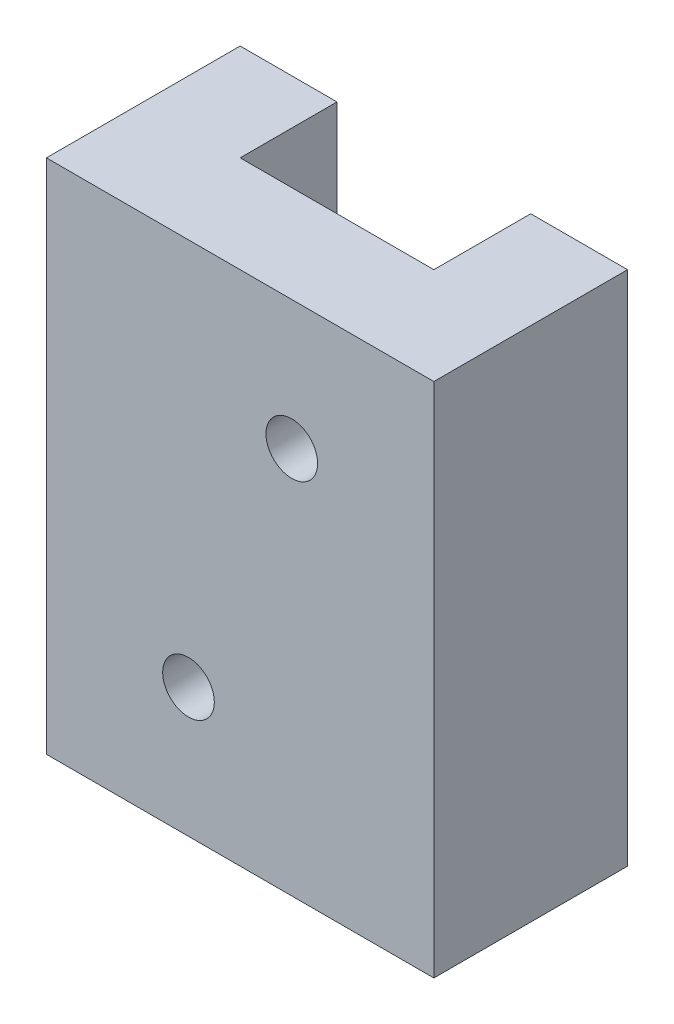
ISO-10303-21;
HEADER;
FILE_DESCRIPTION(('STEP AP214'),'2;1');
FILE_NAME('part.step','',(''),(''),'','','');
FILE_SCHEMA(('AUTOMOTIVE_DESIGN { 1 0 10303 214 1 1 1 1 }'));
ENDSEC;
DATA;
#1=APPLICATION_CONTEXT('core data for automotive mechanical design processes');
#2=APPLICATION_PROTOCOL_DEFINITION('international standard','automotive_design',2000,#1);
#3=PRODUCT_CONTEXT('',#1,'mechanical');
#4=PRODUCT('Part','Part','',(#3));
#5=PRODUCT_RELATED_PRODUCT_CATEGORY('part','',(#4));
#6=PRODUCT_DEFINITION_FORMATION('','',#4);
#7=PRODUCT_DEFINITION_CONTEXT('part definition',#1,'design');
#8=PRODUCT_DEFINITION('design','',#6,#7);
#9=PRODUCT_DEFINITION_SHAPE('','',#8);
#10=(LENGTH_UNIT() NAMED_UNIT(*) SI_UNIT(.MILLI.,.METRE.));
#11=(NAMED_UNIT(*) PLANE_ANGLE_UNIT() SI_UNIT($,.RADIAN.));
#12=(NAMED_UNIT(*) SI_UNIT($,.STERADIAN.) SOLID_ANGLE_UNIT());
#13=UNCERTAINTY_MEASURE_WITH_UNIT(LENGTH_MEASURE(1.E-05),#10,'distance_accuracy_value','');
#14=(GEOMETRIC_REPRESENTATION_CONTEXT(3) GLOBAL_UNCERTAINTY_ASSIGNED_CONTEXT((#13)) GLOBAL_UNIT_ASSIGNED_CONTEXT((#10,
#11,#12)) REPRESENTATION_CONTEXT('',''));
#15=CARTESIAN_POINT('',(0.,0.,0.));
#16=DIRECTION('',(0.,0.,1.));
#17=DIRECTION('',(1.,0.,0.));
#18=AXIS2_PLACEMENT_3D('',#15,#16,#17);
#19=CARTESIAN_POINT('',(-3.75,20.,3.75));
#20=DIRECTION('',(-1.,0.,0.));
#21=DIRECTION('',(0.,0.,1.));
#22=AXIS2_PLACEMENT_3D('',#19,#20,#21);
#23=PLANE('',#22);
#24=DIRECTION('',(0.,0.,-1.));
#25=VECTOR('',#24,1.);
#26=CARTESIAN_POINT('',(-3.75,0.,3.75));
#27=LINE('',#26,#25);
#28=CARTESIAN_POINT('',(-3.75,0.,3.75));
#29=VERTEX_POINT('',#28);
#30=CARTESIAN_POINT('',(-3.75,0.,0.));
#31=VERTEX_POINT('',#30);
#32=EDGE_CURVE('E138',#29,#31,#27,.T.);
#33=ORIENTED_EDGE('',*,*,#32,.T.);
#34=DIRECTION('',(0.,-1.,0.));
#35=VECTOR('',#34,1.);
#36=CARTESIAN_POINT('',(-3.75,20.,0.));
#37=LINE('',#36,#35);
#38=CARTESIAN_POINT('',(-3.75,20.,0.));
#39=VERTEX_POINT('',#38);
#40=EDGE_CURVE('E11',#39,#31,#37,.T.);
#41=ORIENTED_EDGE('',*,*,#40,.F.);
#42=DIRECTION('',(0.,0.,-1.));
#43=VECTOR('',#42,1.);
#44=CARTESIAN_POINT('',(-3.75,20.,3.75));
#45=LINE('',#44,#43);
#46=CARTESIAN_POINT('',(-3.75,20.,3.75));
#47=VERTEX_POINT('',#46);
#48=EDGE_CURVE('E153',#47,#39,#45,.T.);
#49=ORIENTED_EDGE('',*,*,#48,.F.);
#50=DIRECTION('',(0.,-1.,0.));
#51=VECTOR('',#50,1.);
#52=CARTESIAN_POINT('',(-3.75,20.,3.75));
#53=LINE('',#52,#51);
#54=EDGE_CURVE('E134',#47,#29,#53,.T.);
#55=ORIENTED_EDGE('',*,*,#54,.T.);
#56=EDGE_LOOP('',(#33,#41,#49,#55));
#57=FACE_BOUND('',#56,.T.);
#58=ADVANCED_FACE('F42',(#57),#23,.F.);
#59=CARTESIAN_POINT('',(-3.75,20.,0.));
#60=DIRECTION('',(0.,0.,1.));
#61=DIRECTION('',(1.,0.,0.));
#62=AXIS2_PLACEMENT_3D('',#59,#60,#61);
#63=PLANE('',#62);
#64=DIRECTION('',(-1.,0.,0.));
#65=VECTOR('',#64,1.);
#66=CARTESIAN_POINT('',(-3.75,0.,0.));
#67=LINE('',#66,#65);
#68=CARTESIAN_POINT('',(-7.5,0.,0.));
#69=VERTEX_POINT('',#68);
#70=EDGE_CURVE('E141',#31,#69,#67,.T.);
#71=ORIENTED_EDGE('',*,*,#70,.T.);
#72=DIRECTION('',(0.,-1.,0.));
#73=VECTOR('',#72,1.);
#74=CARTESIAN_POINT('',(-7.5,20.,0.));
#75=LINE('',#74,#73);
#76=CARTESIAN_POINT('',(-7.5,20.,0.));
#77=VERTEX_POINT('',#76);
#78=EDGE_CURVE('E50',#77,#69,#75,.T.);
#79=ORIENTED_EDGE('',*,*,#78,.F.);
#80=DIRECTION('',(-1.,0.,0.));
#81=VECTOR('',#80,1.);
#82=CARTESIAN_POINT('',(-3.75,20.,0.));
#83=LINE('',#82,#81);
#84=EDGE_CURVE('E101',#39,#77,#83,.T.);
#85=ORIENTED_EDGE('',*,*,#84,.F.);
#86=ORIENTED_EDGE('',*,*,#40,.T.);
#87=EDGE_LOOP('',(#71,#79,#85,#86));
#88=FACE_BOUND('',#87,.T.);
#89=ADVANCED_FACE('F219',(#88),#63,.F.);
#90=CARTESIAN_POINT('',(-7.5,20.,0.));
#91=DIRECTION('',(1.,0.,0.));
#92=DIRECTION('',(0.,0.,-1.));
#93=AXIS2_PLACEMENT_3D('',#90,#91,#92);
#94=PLANE('',#93);
#95=DIRECTION('',(0.,0.,1.));
#96=VECTOR('',#95,1.);
#97=CARTESIAN_POINT('',(-7.5,0.,0.));
#98=LINE('',#97,#96);
#99=CARTESIAN_POINT('',(-7.5,0.,7.5));
#100=VERTEX_POINT('',#99);
#101=EDGE_CURVE('E144',#69,#100,#98,.T.);
#102=ORIENTED_EDGE('',*,*,#101,.T.);
#103=DIRECTION('',(0.,-1.,0.));
#104=VECTOR('',#103,1.);
#105=CARTESIAN_POINT('',(-7.5,20.,7.5));
#106=LINE('',#105,#104);
#107=CARTESIAN_POINT('',(-7.5,20.,7.5));
#108=VERTEX_POINT('',#107);
#109=EDGE_CURVE('E160',#108,#100,#106,.T.);
#110=ORIENTED_EDGE('',*,*,#109,.F.);
#111=DIRECTION('',(0.,0.,1.));
#112=VECTOR('',#111,1.);
#113=CARTESIAN_POINT('',(-7.5,20.,0.));
#114=LINE('',#113,#112);
#115=EDGE_CURVE('E168',#77,#108,#114,.T.);
#116=ORIENTED_EDGE('',*,*,#115,.F.);
#117=ORIENTED_EDGE('',*,*,#78,.T.);
#118=EDGE_LOOP('',(#102,#110,#116,#117));
#119=FACE_BOUND('',#118,.T.);
#120=ADVANCED_FACE('F166',(#119),#94,.F.);
#121=CARTESIAN_POINT('',(-7.5,20.,7.5));
#122=DIRECTION('',(0.,0.,-1.));
#123=DIRECTION('',(-1.,0.,0.));
#124=AXIS2_PLACEMENT_3D('',#121,#122,#123);
#125=PLANE('',#124);
#126=CARTESIAN_POINT('',(2.,15.,7.5));
#127=DIRECTION('',(0.,0.,1.));
#128=DIRECTION('',(-1.,0.,0.));
#129=AXIS2_PLACEMENT_3D('',#126,#127,#128);
#130=CIRCLE('',#129,1.);
#131=CARTESIAN_POINT('',(1.,15.,7.5));
#132=VERTEX_POINT('',#131);
#133=EDGE_CURVE('E189',#132,#132,#130,.T.);
#134=ORIENTED_EDGE('',*,*,#133,.F.);
#135=EDGE_LOOP('',(#134));
#136=FACE_BOUND('',#135,.T.);
#137=CARTESIAN_POINT('',(-2.,5.,7.5));
#138=DIRECTION('',(0.,0.,1.));
#139=DIRECTION('',(-1.,0.,0.));
#140=AXIS2_PLACEMENT_3D('',#137,#138,#139);
#141=CIRCLE('',#140,1.);
#142=CARTESIAN_POINT('',(-3.,5.,7.5));
#143=VERTEX_POINT('',#142);
#144=EDGE_CURVE('E186',#143,#143,#141,.T.);
#145=ORIENTED_EDGE('',*,*,#144,.F.);
#146=EDGE_LOOP('',(#145));
#147=FACE_BOUND('',#146,.T.);
#148=DIRECTION('',(1.,0.,0.));
#149=VECTOR('',#148,1.);
#150=CARTESIAN_POINT('',(-7.5,0.,7.5));
#151=LINE('',#150,#149);
#152=CARTESIAN_POINT('',(7.5,0.,7.5));
#153=VERTEX_POINT('',#152);
#154=EDGE_CURVE('E146',#100,#153,#151,.T.);
#155=ORIENTED_EDGE('',*,*,#154,.T.);
#156=DIRECTION('',(0.,-1.,0.));
#157=VECTOR('',#156,1.);
#158=CARTESIAN_POINT('',(7.5,20.,7.5));
#159=LINE('',#158,#157);
#160=CARTESIAN_POINT('',(7.5,20.,7.5));
#161=VERTEX_POINT('',#160);
#162=EDGE_CURVE('E157',#161,#153,#159,.T.);
#163=ORIENTED_EDGE('',*,*,#162,.F.);
#164=DIRECTION('',(1.,0.,0.));
#165=VECTOR('',#164,1.);
#166=CARTESIAN_POINT('',(-7.5,20.,7.5));
#167=LINE('',#166,#165);
#168=EDGE_CURVE('E180',#108,#161,#167,.T.);
#169=ORIENTED_EDGE('',*,*,#168,.F.);
#170=ORIENTED_EDGE('',*,*,#109,.T.);
#171=EDGE_LOOP('',(#155,#163,#169,#170));
#172=FACE_BOUND('',#171,.T.);
#173=ADVANCED_FACE('F176',(#136,#147,#172),#125,.F.);
#174=CARTESIAN_POINT('',(7.5,20.,0.));
#175=DIRECTION('',(-1.,0.,0.));
#176=DIRECTION('',(0.,0.,1.));
#177=AXIS2_PLACEMENT_3D('',#174,#175,#176);
#178=PLANE('',#177);
#179=DIRECTION('',(0.,0.,-1.));
#180=VECTOR('',#179,1.);
#181=CARTESIAN_POINT('',(7.5,0.,0.));
#182=LINE('',#181,#180);
#183=CARTESIAN_POINT('',(7.5,0.,0.));
#184=VERTEX_POINT('',#183);
#185=EDGE_CURVE('E148',#153,#184,#182,.T.);
#186=ORIENTED_EDGE('',*,*,#185,.T.);
#187=DIRECTION('',(0.,-1.,0.));
#188=VECTOR('',#187,1.);
#189=CARTESIAN_POINT('',(7.5,20.,0.));
#190=LINE('',#189,#188);
#191=CARTESIAN_POINT('',(7.5,20.,0.));
#192=VERTEX_POINT('',#191);
#193=EDGE_CURVE('E129',#192,#184,#190,.T.);
#194=ORIENTED_EDGE('',*,*,#193,.F.);
#195=DIRECTION('',(0.,0.,-1.));
#196=VECTOR('',#195,1.);
#197=CARTESIAN_POINT('',(7.5,20.,0.));
#198=LINE('',#197,#196);
#199=EDGE_CURVE('E120',#161,#192,#198,.T.);
#200=ORIENTED_EDGE('',*,*,#199,.F.);
#201=ORIENTED_EDGE('',*,*,#162,.T.);
#202=EDGE_LOOP('',(#186,#194,#200,#201));
#203=FACE_BOUND('',#202,.T.);
#204=ADVANCED_FACE('F179',(#203),#178,.F.);
#205=CARTESIAN_POINT('',(3.75,20.,0.));
#206=DIRECTION('',(0.,0.,1.));
#207=DIRECTION('',(1.,0.,0.));
#208=AXIS2_PLACEMENT_3D('',#205,#206,#207);
#209=PLANE('',#208);
#210=DIRECTION('',(-1.,0.,0.));
#211=VECTOR('',#210,1.);
#212=CARTESIAN_POINT('',(3.75,0.,0.));
#213=LINE('',#212,#211);
#214=CARTESIAN_POINT('',(3.75,0.,0.));
#215=VERTEX_POINT('',#214);
#216=EDGE_CURVE('E128',#184,#215,#213,.T.);
#217=ORIENTED_EDGE('',*,*,#216,.T.);
#218=DIRECTION('',(0.,-1.,0.));
#219=VECTOR('',#218,1.);
#220=CARTESIAN_POINT('',(3.75,20.,0.));
#221=LINE('',#220,#219);
#222=CARTESIAN_POINT('',(3.75,20.,0.));
#223=VERTEX_POINT('',#222);
#224=EDGE_CURVE('E125',#223,#215,#221,.T.);
#225=ORIENTED_EDGE('',*,*,#224,.F.);
#226=DIRECTION('',(-1.,0.,0.));
#227=VECTOR('',#226,1.);
#228=CARTESIAN_POINT('',(3.75,20.,0.));
#229=LINE('',#228,#227);
#230=EDGE_CURVE('E114',#192,#223,#229,.T.);
#231=ORIENTED_EDGE('',*,*,#230,.F.);
#232=ORIENTED_EDGE('',*,*,#193,.T.);
#233=EDGE_LOOP('',(#217,#225,#231,#232));
#234=FACE_BOUND('',#233,.T.);
#235=ADVANCED_FACE('F126',(#234),#209,.F.);
#236=CARTESIAN_POINT('',(3.75,20.,3.75));
#237=DIRECTION('',(1.,0.,0.));
#238=DIRECTION('',(0.,0.,-1.));
#239=AXIS2_PLACEMENT_3D('',#236,#237,#238);
#240=PLANE('',#239);
#241=DIRECTION('',(0.,0.,1.));
#242=VECTOR('',#241,1.);
#243=CARTESIAN_POINT('',(3.75,0.,3.75));
#244=LINE('',#243,#242);
#245=CARTESIAN_POINT('',(3.75,0.,3.75));
#246=VERTEX_POINT('',#245);
#247=EDGE_CURVE('E87',#215,#246,#244,.T.);
#248=ORIENTED_EDGE('',*,*,#247,.T.);
#249=DIRECTION('',(0.,-1.,0.));
#250=VECTOR('',#249,1.);
#251=CARTESIAN_POINT('',(3.75,20.,3.75));
#252=LINE('',#251,#250);
#253=CARTESIAN_POINT('',(3.75,20.,3.75));
#254=VERTEX_POINT('',#253);
#255=EDGE_CURVE('E130',#254,#246,#252,.T.);
#256=ORIENTED_EDGE('',*,*,#255,.F.);
#257=DIRECTION('',(0.,0.,1.));
#258=VECTOR('',#257,1.);
#259=CARTESIAN_POINT('',(3.75,20.,3.75));
#260=LINE('',#259,#258);
#261=EDGE_CURVE('E118',#223,#254,#260,.T.);
#262=ORIENTED_EDGE('',*,*,#261,.F.);
#263=ORIENTED_EDGE('',*,*,#224,.T.);
#264=EDGE_LOOP('',(#248,#256,#262,#263));
#265=FACE_BOUND('',#264,.T.);
#266=ADVANCED_FACE('F132',(#265),#240,.F.);
#267=CARTESIAN_POINT('',(-3.75,20.,3.75));
#268=DIRECTION('',(0.,0.,1.));
#269=DIRECTION('',(1.,0.,0.));
#270=AXIS2_PLACEMENT_3D('',#267,#268,#269);
#271=PLANE('',#270);
#272=CARTESIAN_POINT('',(2.,15.,3.75));
#273=DIRECTION('',(0.,0.,1.));
#274=DIRECTION('',(1.,0.,0.));
#275=AXIS2_PLACEMENT_3D('',#272,#273,#274);
#276=CIRCLE('',#275,1.);
#277=CARTESIAN_POINT('',(3.,15.,3.75));
#278=VERTEX_POINT('',#277);
#279=EDGE_CURVE('E142',#278,#278,#276,.F.);
#280=ORIENTED_EDGE('',*,*,#279,.F.);
#281=EDGE_LOOP('',(#280));
#282=FACE_BOUND('',#281,.T.);
#283=CARTESIAN_POINT('',(-2.,5.,3.75));
#284=DIRECTION('',(0.,0.,1.));
#285=DIRECTION('',(1.,0.,0.));
#286=AXIS2_PLACEMENT_3D('',#283,#284,#285);
#287=CIRCLE('',#286,1.);
#288=CARTESIAN_POINT('',(-1.,5.,3.75));
#289=VERTEX_POINT('',#288);
#290=EDGE_CURVE('E190',#289,#289,#287,.F.);
#291=ORIENTED_EDGE('',*,*,#290,.F.);
#292=EDGE_LOOP('',(#291));
#293=FACE_BOUND('',#292,.T.);
#294=DIRECTION('',(-1.,0.,0.));
#295=VECTOR('',#294,1.);
#296=CARTESIAN_POINT('',(-3.75,0.,3.75));
#297=LINE('',#296,#295);
#298=EDGE_CURVE('E93',#246,#29,#297,.T.);
#299=ORIENTED_EDGE('',*,*,#298,.T.);
#300=ORIENTED_EDGE('',*,*,#54,.F.);
#301=DIRECTION('',(-1.,0.,0.));
#302=VECTOR('',#301,1.);
#303=CARTESIAN_POINT('',(-3.75,20.,3.75));
#304=LINE('',#303,#302);
#305=EDGE_CURVE('E58',#254,#47,#304,.T.);
#306=ORIENTED_EDGE('',*,*,#305,.F.);
#307=ORIENTED_EDGE('',*,*,#255,.T.);
#308=EDGE_LOOP('',(#299,#300,#306,#307));
#309=FACE_BOUND('',#308,.T.);
#310=ADVANCED_FACE('F226',(#282,#293,#309),#271,.F.);
#311=CARTESIAN_POINT('',(0.,20.,0.));
#312=DIRECTION('',(0.,1.,0.));
#313=DIRECTION('',(0.,0.,1.));
#314=AXIS2_PLACEMENT_3D('',#311,#312,#313);
#315=PLANE('',#314);
#316=ORIENTED_EDGE('',*,*,#48,.T.);
#317=ORIENTED_EDGE('',*,*,#84,.T.);
#318=ORIENTED_EDGE('',*,*,#115,.T.);
#319=ORIENTED_EDGE('',*,*,#168,.T.);
#320=ORIENTED_EDGE('',*,*,#199,.T.);
#321=ORIENTED_EDGE('',*,*,#230,.T.);
#322=ORIENTED_EDGE('',*,*,#261,.T.);
#323=ORIENTED_EDGE('',*,*,#305,.T.);
#324=EDGE_LOOP('',(#316,#317,#318,#319,#320,#321,#322,#323));
#325=FACE_BOUND('',#324,.T.);
#326=ADVANCED_FACE('F116',(#325),#315,.T.);
#327=CARTESIAN_POINT('',(0.,0.,0.));
#328=DIRECTION('',(0.,1.,0.));
#329=DIRECTION('',(0.,0.,1.));
#330=AXIS2_PLACEMENT_3D('',#327,#328,#329);
#331=PLANE('',#330);
#332=ORIENTED_EDGE('',*,*,#32,.F.);
#333=ORIENTED_EDGE('',*,*,#298,.F.);
#334=ORIENTED_EDGE('',*,*,#247,.F.);
#335=ORIENTED_EDGE('',*,*,#216,.F.);
#336=ORIENTED_EDGE('',*,*,#185,.F.);
#337=ORIENTED_EDGE('',*,*,#154,.F.);
#338=ORIENTED_EDGE('',*,*,#101,.F.);
#339=ORIENTED_EDGE('',*,*,#70,.F.);
#340=EDGE_LOOP('',(#332,#333,#334,#335,#336,#337,#338,#339));
#341=FACE_BOUND('',#340,.T.);
#342=ADVANCED_FACE('F172',(#341),#331,.F.);
#343=CARTESIAN_POINT('',(-2.,5.,0.921572875253807));
#344=DIRECTION('',(0.,0.,1.));
#345=DIRECTION('',(1.,0.,0.));
#346=AXIS2_PLACEMENT_3D('',#343,#344,#345);
#347=CYLINDRICAL_SURFACE('',#346,1.);
#348=ORIENTED_EDGE('',*,*,#290,.T.);
#349=EDGE_LOOP('',(#348));
#350=FACE_BOUND('',#349,.T.);
#351=ORIENTED_EDGE('',*,*,#144,.T.);
#352=EDGE_LOOP('',(#351));
#353=FACE_BOUND('',#352,.T.);
#354=ADVANCED_FACE('F205',(#350,#353),#347,.F.);
#355=CARTESIAN_POINT('',(2.,15.,0.921572875253807));
#356=DIRECTION('',(0.,0.,1.));
#357=DIRECTION('',(1.,0.,0.));
#358=AXIS2_PLACEMENT_3D('',#355,#356,#357);
#359=CYLINDRICAL_SURFACE('',#358,1.);
#360=ORIENTED_EDGE('',*,*,#279,.T.);
#361=EDGE_LOOP('',(#360));
#362=FACE_BOUND('',#361,.T.);
#363=ORIENTED_EDGE('',*,*,#133,.T.);
#364=EDGE_LOOP('',(#363));
#365=FACE_BOUND('',#364,.T.);
#366=ADVANCED_FACE('F198',(#362,#365),#359,.F.);
#367=CLOSED_SHELL('',(#58,#89,#120,#173,#204,#235,#266,#310,#326,#342,#354,#366));
#368=MANIFOLD_SOLID_BREP('B2',#367);
#369=ADVANCED_BREP_SHAPE_REPRESENTATION('',(#18,#368),#14);
#370=SHAPE_DEFINITION_REPRESENTATION(#9,#369);
ENDSEC;
END-ISO-10303-21;
